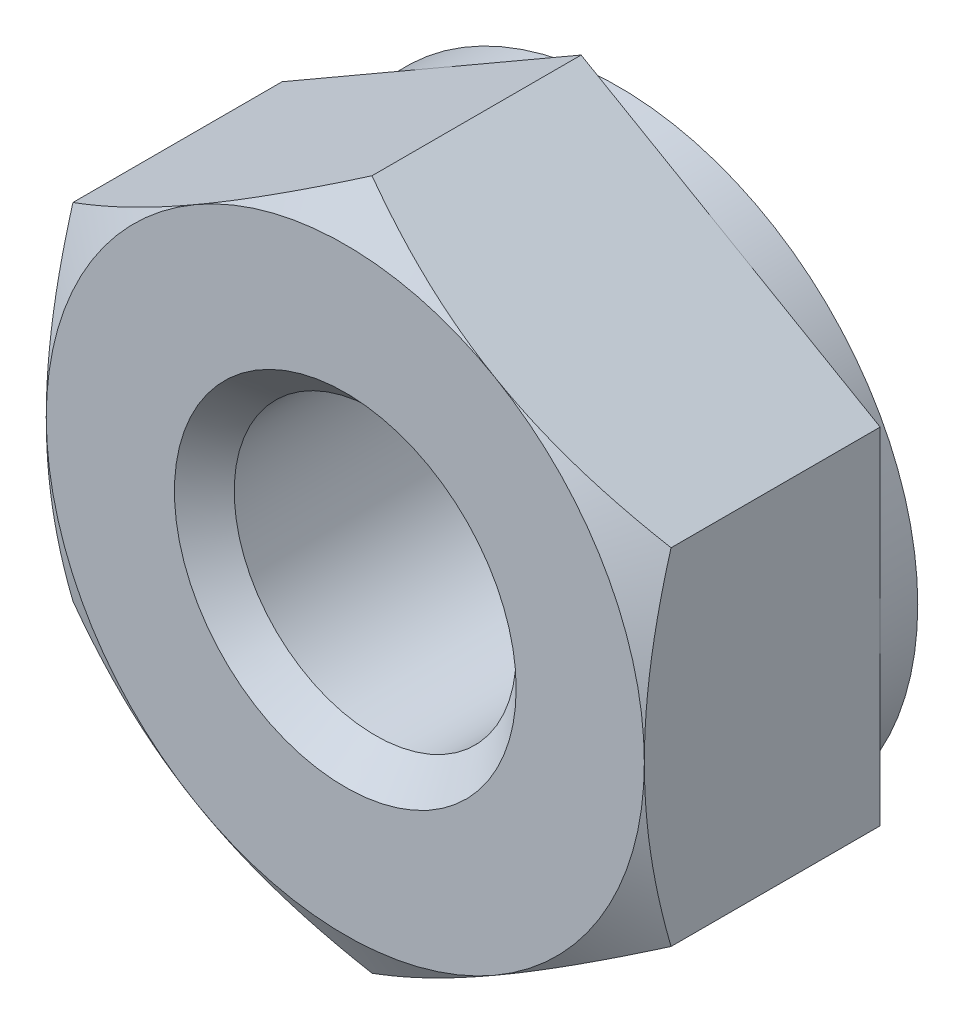
ISO-10303-21;
HEADER;
FILE_DESCRIPTION(('STEP AP214'),'2;1');
FILE_NAME('part.step','',(''),(''),'','','');
FILE_SCHEMA(('AUTOMOTIVE_DESIGN { 1 0 10303 214 1 1 1 1 }'));
ENDSEC;
DATA;
#1=APPLICATION_CONTEXT('core data for automotive mechanical design processes');
#2=APPLICATION_PROTOCOL_DEFINITION('international standard','automotive_design',2000,#1);
#3=PRODUCT_CONTEXT('',#1,'mechanical');
#4=PRODUCT('Part','Part','',(#3));
#5=PRODUCT_RELATED_PRODUCT_CATEGORY('part','',(#4));
#6=PRODUCT_DEFINITION_FORMATION('','',#4);
#7=PRODUCT_DEFINITION_CONTEXT('part definition',#1,'design');
#8=PRODUCT_DEFINITION('design','',#6,#7);
#9=PRODUCT_DEFINITION_SHAPE('','',#8);
#10=(LENGTH_UNIT() NAMED_UNIT(*) SI_UNIT(.MILLI.,.METRE.));
#11=(NAMED_UNIT(*) PLANE_ANGLE_UNIT() SI_UNIT($,.RADIAN.));
#12=(NAMED_UNIT(*) SI_UNIT($,.STERADIAN.) SOLID_ANGLE_UNIT());
#13=UNCERTAINTY_MEASURE_WITH_UNIT(LENGTH_MEASURE(1.E-05),#10,'distance_accuracy_value','');
#14=(GEOMETRIC_REPRESENTATION_CONTEXT(3) GLOBAL_UNCERTAINTY_ASSIGNED_CONTEXT((#13)) GLOBAL_UNIT_ASSIGNED_CONTEXT((#10,
#11,#12)) REPRESENTATION_CONTEXT('',''));
#15=CARTESIAN_POINT('',(0.,0.,0.));
#16=DIRECTION('',(0.,0.,1.));
#17=DIRECTION('',(1.,0.,0.));
#18=AXIS2_PLACEMENT_3D('',#15,#16,#17);
#19=CARTESIAN_POINT('',(3.5,2.02072594216369,-3.2));
#20=DIRECTION('',(0.5,0.866025403784439,0.));
#21=DIRECTION('',(-0.866025403784439,0.5,0.));
#22=AXIS2_PLACEMENT_3D('',#19,#20,#21);
#23=PLANE('',#22);
#24=CARTESIAN_POINT('',(3.5002,2.02061047210985,-0.312674060693367));
#25=CARTESIAN_POINT('',(3.34639282154755,2.10941108799267,-0.261385788989983));
#26=CARTESIAN_POINT('',(3.19125798916558,2.1989782252291,-0.214740953816198));
#27=CARTESIAN_POINT('',(2.87830199342322,2.37966345361545,-0.133321875533351));
#28=CARTESIAN_POINT('',(2.72047526921251,2.47078475532382,-0.0985764355845635));
#29=CARTESIAN_POINT('',(2.40677778961988,2.65189807961074,-0.0444900271828384));
#30=CARTESIAN_POINT('',(2.25095530083931,2.74186223545399,-0.0247890862603842));
#31=CARTESIAN_POINT('',(1.93857711279463,2.92221386641056,-0.0012701327372563));
#32=CARTESIAN_POINT('',(1.78202254896577,3.01260068598001,0.00256735545443381));
#33=CARTESIAN_POINT('',(1.48949078007901,3.1814939814933,-0.00541530187697864));
#34=CARTESIAN_POINT('',(1.3534697875421,3.26002573814993,-0.0152754340696089));
#35=CARTESIAN_POINT('',(1.08231397971101,3.41657761679354,-0.0465264668994056));
#36=CARTESIAN_POINT('',(0.947180102315321,3.49459719728458,-0.0679280432857999));
#37=CARTESIAN_POINT('',(0.675465207594819,3.65147186489429,-0.121430407880578));
#38=CARTESIAN_POINT('',(0.538918580721668,3.73030709667644,-0.153757994445088));
#39=CARTESIAN_POINT('',(0.267861907055501,3.88680174018324,-0.227128933807995));
#40=CARTESIAN_POINT('',(0.133348387531466,3.96446315689009,-0.268155046569867));
#41=CARTESIAN_POINT('',(-0.000199999999999092,4.04156735438122,-0.312674060693368));
#42=B_SPLINE_CURVE_WITH_KNOTS('',3,(#24,#25,#26,#27,#28,#29,#30,#31,#32,#33,#34,#35,#36,#37,#38,
#39,#40,#41),.UNSPECIFIED.,.F.,.F.,(4,2,2,2,2,2,2,2,4),(0.,0.554793832886252,1.11092123814983,
1.65328467083218,2.19498204478403,2.66665130850859,3.13875761298267,3.62133612600509,
4.10296698719187),.UNSPECIFIED.);
#43=CARTESIAN_POINT('',(3.5,2.02072594216369,-0.31260739116964));
#44=VERTEX_POINT('',#43);
#45=CARTESIAN_POINT('',(1.75,3.03108891324554,0.));
#46=VERTEX_POINT('',#45);
#47=EDGE_CURVE('E218',#44,#46,#42,.T.);
#48=ORIENTED_EDGE('',*,*,#47,.F.);
#49=DIRECTION('',(0.,0.,1.));
#50=VECTOR('',#49,1.);
#51=CARTESIAN_POINT('',(3.5,2.02072594216369,-3.2));
#52=LINE('',#51,#50);
#53=CARTESIAN_POINT('',(3.5,2.02072594216369,-2.76));
#54=VERTEX_POINT('',#53);
#55=EDGE_CURVE('E148',#54,#44,#52,.T.);
#56=ORIENTED_EDGE('',*,*,#55,.F.);
#57=DIRECTION('',(0.866025403784439,-0.5,0.));
#58=VECTOR('',#57,1.);
#59=CARTESIAN_POINT('',(3.5,2.02072594216369,-2.76));
#60=LINE('',#59,#58);
#61=CARTESIAN_POINT('',(1.75,3.03108891324554,-2.76));
#62=VERTEX_POINT('',#61);
#63=EDGE_CURVE('E288',#62,#54,#60,.T.);
#64=ORIENTED_EDGE('',*,*,#63,.F.);
#65=CARTESIAN_POINT('',(0.,4.04145188432738,-2.76));
#66=VERTEX_POINT('',#65);
#67=EDGE_CURVE('E140',#66,#62,#60,.T.);
#68=ORIENTED_EDGE('',*,*,#67,.F.);
#69=DIRECTION('',(0.,0.,1.));
#70=VECTOR('',#69,1.);
#71=CARTESIAN_POINT('',(0.,4.04145188432738,-3.2));
#72=LINE('',#71,#70);
#73=CARTESIAN_POINT('',(0.,4.04145188432738,-0.31260739116964));
#74=VERTEX_POINT('',#73);
#75=EDGE_CURVE('E135',#66,#74,#72,.T.);
#76=ORIENTED_EDGE('',*,*,#75,.T.);
#77=EDGE_CURVE('E127',#46,#74,#42,.T.);
#78=ORIENTED_EDGE('',*,*,#77,.F.);
#79=EDGE_LOOP('',(#48,#56,#64,#68,#76,#78));
#80=FACE_BOUND('',#79,.T.);
#81=ADVANCED_FACE('F17',(#80),#23,.T.);
#82=CARTESIAN_POINT('',(3.5,-2.02072594216369,-3.2));
#83=DIRECTION('',(1.,0.,0.));
#84=DIRECTION('',(0.,0.,-1.));
#85=AXIS2_PLACEMENT_3D('',#82,#83,#84);
#86=PLANE('',#85);
#87=CARTESIAN_POINT('',(3.5,-5.35926299121405,-1.67484346858553));
#88=CARTESIAN_POINT('',(3.5,-5.20559319908841,-1.60058173692102));
#89=CARTESIAN_POINT('',(3.5,-5.05156008083374,-1.52705822833146));
#90=CARTESIAN_POINT('',(3.5,-4.74257074180709,-1.38190950344751));
#91=CARTESIAN_POINT('',(3.5,-4.58761436682436,-1.31028461582132));
#92=CARTESIAN_POINT('',(3.5,-4.27574500225541,-1.16897765517623));
#93=CARTESIAN_POINT('',(3.5,-4.11882589028191,-1.09930904568015));
#94=CARTESIAN_POINT('',(3.5,-3.80369792903854,-0.962964262242751));
#95=CARTESIAN_POINT('',(3.5,-3.64548914750594,-0.896287932319509));
#96=CARTESIAN_POINT('',(3.5,-3.32556618401854,-0.76593181909506));
#97=CARTESIAN_POINT('',(3.5,-3.16383281219923,-0.702298873688858));
#98=CARTESIAN_POINT('',(3.5,-2.83845840945597,-0.580016702089487));
#99=CARTESIAN_POINT('',(3.5,-2.67481716858825,-0.521368030370687));
#100=CARTESIAN_POINT('',(3.5,-2.34570278472049,-0.410630279877018));
#101=CARTESIAN_POINT('',(3.5,-2.18023438248742,-0.358527255435855));
#102=CARTESIAN_POINT('',(3.5,-1.84694522806369,-0.26257293697644));
#103=CARTESIAN_POINT('',(3.5,-1.6791252378753,-0.218719033467154));
#104=CARTESIAN_POINT('',(3.5,-1.34101828610925,-0.141391945584783));
#105=CARTESIAN_POINT('',(3.5,-1.17073068027693,-0.107921525211972));
#106=CARTESIAN_POINT('',(3.5,-0.828102385138484,-0.0536149564320513));
#107=CARTESIAN_POINT('',(3.5,-0.655761694017302,-0.032778819195237));
#108=CARTESIAN_POINT('',(3.5,-0.311020490924451,-0.00558408650575726));
#109=CARTESIAN_POINT('',(3.5,-0.138627397207261,0.000866163165910186));
#110=CARTESIAN_POINT('',(3.5,0.206038074906533,-0.00105355807794645));
#111=CARTESIAN_POINT('',(3.5,0.378310473023176,-0.00941968196343097));
#112=CARTESIAN_POINT('',(3.5,0.672490555822325,-0.035768892786891));
#113=CARTESIAN_POINT('',(3.5,0.794722791084092,-0.0503206340384211));
#114=CARTESIAN_POINT('',(3.5,1.03824305430561,-0.0859367340533567));
#115=CARTESIAN_POINT('',(3.5,1.15953093025887,-0.107002119926142));
#116=CARTESIAN_POINT('',(3.5,1.5218791477135,-0.178863187081455));
#117=CARTESIAN_POINT('',(3.5,1.76124104212634,-0.238305275622014));
#118=CARTESIAN_POINT('',(3.5,2.11940971387711,-0.34082681440256));
#119=CARTESIAN_POINT('',(3.5,2.24008344316349,-0.37774969908519));
#120=CARTESIAN_POINT('',(3.5,2.48017139213732,-0.455249007699302));
#121=CARTESIAN_POINT('',(3.5,2.59958641795616,-0.495822911663559));
#122=CARTESIAN_POINT('',(3.5,2.83665760451802,-0.579779986782763));
#123=CARTESIAN_POINT('',(3.5,2.95431988203487,-0.623146060034327));
#124=CARTESIAN_POINT('',(3.5,3.18873153508804,-0.712423559566878));
#125=CARTESIAN_POINT('',(3.5,3.30548051959469,-0.758336014592961));
#126=CARTESIAN_POINT('',(3.5,3.42180736613354,-0.805270380724077));
#127=B_SPLINE_CURVE_WITH_KNOTS('',3,(#87,#88,#89,#90,#91,#92,#93,#94,#95,#96,#97,#98,#99,#100,
#101,#102,#103,#104,#105,#106,#107,#108,#109,#110,#111,#112,#113,#114,#115,#116,#117,#118,#119,
#120,#121,#122,#123,#124,#125,#126),.UNSPECIFIED.,.F.,.F.,(4,2,2,2,2,2,2,2,2,2,2,2,2,2,2,2,2,2,
2,4),(0.,0.512025318465735,1.02413870177436,1.5391827031524,2.05419982499223,2.57553975872797,
3.09693761309352,3.61720506610399,4.13730766217536,4.65754858684363,5.17778997146959,
5.6947072512228,6.21149033452398,6.5805962322233,6.94976036239484,7.68863804939852,
8.06719621660479,8.44549507476762,8.82166461280102,9.19798724733413),.UNSPECIFIED.);
#128=CARTESIAN_POINT('',(3.5,-2.02072594216369,-0.31260739116964));
#129=VERTEX_POINT('',#128);
#130=CARTESIAN_POINT('',(3.5,0.,0.));
#131=VERTEX_POINT('',#130);
#132=EDGE_CURVE('E247',#129,#131,#127,.T.);
#133=ORIENTED_EDGE('',*,*,#132,.F.);
#134=DIRECTION('',(0.,0.,1.));
#135=VECTOR('',#134,1.);
#136=CARTESIAN_POINT('',(3.5,-2.02072594216369,-3.2));
#137=LINE('',#136,#135);
#138=CARTESIAN_POINT('',(3.5,-2.02072594216369,-2.76));
#139=VERTEX_POINT('',#138);
#140=EDGE_CURVE('E308',#139,#129,#137,.T.);
#141=ORIENTED_EDGE('',*,*,#140,.F.);
#142=DIRECTION('',(0.,-1.,0.));
#143=VECTOR('',#142,1.);
#144=CARTESIAN_POINT('',(3.5,-2.02072594216369,-2.76));
#145=LINE('',#144,#143);
#146=CARTESIAN_POINT('',(3.5,0.,-2.76));
#147=VERTEX_POINT('',#146);
#148=EDGE_CURVE('E303',#147,#139,#145,.T.);
#149=ORIENTED_EDGE('',*,*,#148,.F.);
#150=EDGE_CURVE('E293',#54,#147,#145,.T.);
#151=ORIENTED_EDGE('',*,*,#150,.F.);
#152=ORIENTED_EDGE('',*,*,#55,.T.);
#153=EDGE_CURVE('E243',#131,#44,#127,.T.);
#154=ORIENTED_EDGE('',*,*,#153,.F.);
#155=EDGE_LOOP('',(#133,#141,#149,#151,#152,#154));
#156=FACE_BOUND('',#155,.T.);
#157=ADVANCED_FACE('F197',(#156),#86,.T.);
#158=CARTESIAN_POINT('',(0.,-4.04145188432738,-3.2));
#159=DIRECTION('',(0.5,-0.866025403784439,0.));
#160=DIRECTION('',(0.866025403784439,0.5,0.));
#161=AXIS2_PLACEMENT_3D('',#158,#159,#160);
#162=PLANE('',#161);
#163=CARTESIAN_POINT('',(-0.000200000000000895,-4.04156735438122,-0.312674060693367));
#164=CARTESIAN_POINT('',(0.153607178452448,-3.9527667384984,-0.261385788989982));
#165=CARTESIAN_POINT('',(0.308742010834422,-3.86319960126198,-0.214740953816196));
#166=CARTESIAN_POINT('',(0.621698006576779,-3.68251437287562,-0.133321875533349));
#167=CARTESIAN_POINT('',(0.779524730787493,-3.59139307116725,-0.0985764355845612));
#168=CARTESIAN_POINT('',(1.09322221038012,-3.41027974688034,-0.0444900271828357));
#169=CARTESIAN_POINT('',(1.24904469916069,-3.32031559103708,-0.0247890862603811));
#170=CARTESIAN_POINT('',(1.56142288720537,-3.13996396008052,-0.00127013273725415));
#171=CARTESIAN_POINT('',(1.71797745103423,-3.04957714051106,0.00256735545443465));
#172=CARTESIAN_POINT('',(2.01050921992099,-2.88068384499778,-0.00541530187697761));
#173=CARTESIAN_POINT('',(2.1465302124579,-2.80215208834115,-0.0152754340696067));
#174=CARTESIAN_POINT('',(2.41768602028899,-2.64560020969753,-0.0465264668994026));
#175=CARTESIAN_POINT('',(2.55281989768468,-2.5675806292065,-0.0679280432857972));
#176=CARTESIAN_POINT('',(2.82453479240518,-2.41070596159678,-0.121430407880576));
#177=CARTESIAN_POINT('',(2.96108141927833,-2.33187072981463,-0.153757994445086));
#178=CARTESIAN_POINT('',(3.2321380929445,-2.17537608630783,-0.227128933807992));
#179=CARTESIAN_POINT('',(3.36665161246853,-2.09771466960098,-0.268155046569864));
#180=CARTESIAN_POINT('',(3.5002,-2.02061047210985,-0.312674060693366));
#181=B_SPLINE_CURVE_WITH_KNOTS('',3,(#163,#164,#165,#166,#167,#168,#169,#170,#171,#172,#173,
#174,#175,#176,#177,#178,#179,#180),.UNSPECIFIED.,.F.,.F.,(4,2,2,2,2,2,2,2,4),(0.,
0.554793832886252,1.11092123814983,1.65328467083218,2.19498204478403,2.6666513085086,
3.13875761298267,3.62133612600509,4.10296698719187),.UNSPECIFIED.);
#182=CARTESIAN_POINT('',(0.,-4.04145188432738,-0.31260739116964));
#183=VERTEX_POINT('',#182);
#184=CARTESIAN_POINT('',(1.75,-3.03108891324554,0.));
#185=VERTEX_POINT('',#184);
#186=EDGE_CURVE('E32',#183,#185,#181,.T.);
#187=ORIENTED_EDGE('',*,*,#186,.F.);
#188=DIRECTION('',(0.,0.,1.));
#189=VECTOR('',#188,1.);
#190=CARTESIAN_POINT('',(0.,-4.04145188432738,-3.2));
#191=LINE('',#190,#189);
#192=CARTESIAN_POINT('',(0.,-4.04145188432738,-2.76));
#193=VERTEX_POINT('',#192);
#194=EDGE_CURVE('E137',#193,#183,#191,.T.);
#195=ORIENTED_EDGE('',*,*,#194,.F.);
#196=DIRECTION('',(-0.866025403784439,-0.5,0.));
#197=VECTOR('',#196,1.);
#198=CARTESIAN_POINT('',(0.,-4.04145188432738,-2.76));
#199=LINE('',#198,#197);
#200=CARTESIAN_POINT('',(1.75,-3.03108891324554,-2.76));
#201=VERTEX_POINT('',#200);
#202=EDGE_CURVE('E319',#201,#193,#199,.T.);
#203=ORIENTED_EDGE('',*,*,#202,.F.);
#204=EDGE_CURVE('E339',#139,#201,#199,.T.);
#205=ORIENTED_EDGE('',*,*,#204,.F.);
#206=ORIENTED_EDGE('',*,*,#140,.T.);
#207=EDGE_CURVE('E248',#185,#129,#181,.T.);
#208=ORIENTED_EDGE('',*,*,#207,.F.);
#209=EDGE_LOOP('',(#187,#195,#203,#205,#206,#208));
#210=FACE_BOUND('',#209,.T.);
#211=ADVANCED_FACE('F204',(#210),#162,.T.);
#212=CARTESIAN_POINT('',(-3.5,-2.02072594216369,-3.2));
#213=DIRECTION('',(-0.5,-0.866025403784439,0.));
#214=DIRECTION('',(0.866025403784439,-0.5,0.));
#215=AXIS2_PLACEMENT_3D('',#212,#213,#214);
#216=PLANE('',#215);
#217=CARTESIAN_POINT('',(-3.5002,-2.02061047210985,-0.312674060693367));
#218=CARTESIAN_POINT('',(-3.34639282154755,-2.10941108799267,-0.261385788989982));
#219=CARTESIAN_POINT('',(-3.19125798916558,-2.19897822522909,-0.214740953816196));
#220=CARTESIAN_POINT('',(-2.87830199342322,-2.37966345361545,-0.133321875533349));
#221=CARTESIAN_POINT('',(-2.7204752692125,-2.47078475532382,-0.0985764355845613));
#222=CARTESIAN_POINT('',(-2.40677778961987,-2.65189807961073,-0.0444900271828359));
#223=CARTESIAN_POINT('',(-2.25095530083931,-2.74186223545399,-0.0247890862603814));
#224=CARTESIAN_POINT('',(-1.93857711279463,-2.92221386641055,-0.0012701327372542));
#225=CARTESIAN_POINT('',(-1.78202254896577,-3.01260068598001,0.00256735545443505));
#226=CARTESIAN_POINT('',(-1.48949078007901,-3.1814939814933,-0.00541530187697725));
#227=CARTESIAN_POINT('',(-1.3534697875421,-3.26002573814993,-0.0152754340696067));
#228=CARTESIAN_POINT('',(-1.08231397971101,-3.41657761679353,-0.0465264668994029));
#229=CARTESIAN_POINT('',(-0.947180102315318,-3.49459719728457,-0.0679280432857973));
#230=CARTESIAN_POINT('',(-0.675465207594817,-3.65147186489429,-0.121430407880576));
#231=CARTESIAN_POINT('',(-0.538918580721665,-3.73030709667644,-0.153757994445086));
#232=CARTESIAN_POINT('',(-0.267861907055499,-3.88680174018324,-0.227128933807993));
#233=CARTESIAN_POINT('',(-0.133348387531463,-3.96446315689009,-0.268155046569865));
#234=CARTESIAN_POINT('',(0.000199999999999406,-4.04156735438122,-0.312674060693367));
#235=B_SPLINE_CURVE_WITH_KNOTS('',3,(#217,#218,#219,#220,#221,#222,#223,#224,#225,#226,#227,
#228,#229,#230,#231,#232,#233,#234),.UNSPECIFIED.,.F.,.F.,(4,2,2,2,2,2,2,2,4),(0.,
0.554793832886253,1.11092123814984,1.65328467083218,2.19498204478403,2.6666513085086,
3.13875761298267,3.6213361260051,4.10296698719187),.UNSPECIFIED.);
#236=CARTESIAN_POINT('',(-3.5,-2.02072594216369,-0.31260739116964));
#237=VERTEX_POINT('',#236);
#238=CARTESIAN_POINT('',(-1.75,-3.03108891324554,0.));
#239=VERTEX_POINT('',#238);
#240=EDGE_CURVE('E40',#237,#239,#235,.T.);
#241=ORIENTED_EDGE('',*,*,#240,.F.);
#242=DIRECTION('',(0.,0.,1.));
#243=VECTOR('',#242,1.);
#244=CARTESIAN_POINT('',(-3.5,-2.02072594216369,-3.2));
#245=LINE('',#244,#243);
#246=CARTESIAN_POINT('',(-3.5,-2.02072594216369,-2.76));
#247=VERTEX_POINT('',#246);
#248=EDGE_CURVE('E134',#247,#237,#245,.T.);
#249=ORIENTED_EDGE('',*,*,#248,.F.);
#250=DIRECTION('',(-0.866025403784439,0.5,0.));
#251=VECTOR('',#250,1.);
#252=CARTESIAN_POINT('',(-3.5,-2.02072594216369,-2.76));
#253=LINE('',#252,#251);
#254=CARTESIAN_POINT('',(-1.75,-3.03108891324554,-2.76));
#255=VERTEX_POINT('',#254);
#256=EDGE_CURVE('E343',#255,#247,#253,.T.);
#257=ORIENTED_EDGE('',*,*,#256,.F.);
#258=EDGE_CURVE('E316',#193,#255,#253,.T.);
#259=ORIENTED_EDGE('',*,*,#258,.F.);
#260=ORIENTED_EDGE('',*,*,#194,.T.);
#261=EDGE_CURVE('E314',#239,#183,#235,.T.);
#262=ORIENTED_EDGE('',*,*,#261,.F.);
#263=EDGE_LOOP('',(#241,#249,#257,#259,#260,#262));
#264=FACE_BOUND('',#263,.T.);
#265=ADVANCED_FACE('F259',(#264),#216,.T.);
#266=CARTESIAN_POINT('',(-3.5,2.02072594216369,-3.2));
#267=DIRECTION('',(-1.,0.,0.));
#268=DIRECTION('',(0.,0.,1.));
#269=AXIS2_PLACEMENT_3D('',#266,#267,#268);
#270=PLANE('',#269);
#271=CARTESIAN_POINT('',(-3.5,-5.35926299121405,-1.67484346858553));
#272=CARTESIAN_POINT('',(-3.5,-5.20559319908841,-1.60058173692102));
#273=CARTESIAN_POINT('',(-3.5,-5.05156008083374,-1.52705822833146));
#274=CARTESIAN_POINT('',(-3.5,-4.74257074180709,-1.38190950344751));
#275=CARTESIAN_POINT('',(-3.5,-4.58761436682435,-1.31028461582132));
#276=CARTESIAN_POINT('',(-3.5,-4.27574500225541,-1.16897765517623));
#277=CARTESIAN_POINT('',(-3.5,-4.11882589028191,-1.09930904568015));
#278=CARTESIAN_POINT('',(-3.5,-3.80369792903854,-0.962964262242751));
#279=CARTESIAN_POINT('',(-3.5,-3.64548914750594,-0.896287932319509));
#280=CARTESIAN_POINT('',(-3.5,-3.32556618401854,-0.765931819095059));
#281=CARTESIAN_POINT('',(-3.5,-3.16383281219923,-0.702298873688857));
#282=CARTESIAN_POINT('',(-3.5,-2.83845840945596,-0.580016702089486));
#283=CARTESIAN_POINT('',(-3.5,-2.67481716858825,-0.521368030370686));
#284=CARTESIAN_POINT('',(-3.5,-2.34570278472048,-0.410630279877017));
#285=CARTESIAN_POINT('',(-3.5,-2.18023438248742,-0.358527255435854));
#286=CARTESIAN_POINT('',(-3.5,-1.84694522806369,-0.26257293697644));
#287=CARTESIAN_POINT('',(-3.5,-1.67912523787529,-0.218719033467155));
#288=CARTESIAN_POINT('',(-3.5,-1.34101828610924,-0.141391945584784));
#289=CARTESIAN_POINT('',(-3.5,-1.17073068027693,-0.107921525211971));
#290=CARTESIAN_POINT('',(-3.5,-0.82810238513848,-0.0536149564320502));
#291=CARTESIAN_POINT('',(-3.5,-0.655761694017298,-0.0327788191952366));
#292=CARTESIAN_POINT('',(-3.5,-0.311020490924447,-0.00558408650575719));
#293=CARTESIAN_POINT('',(-3.5,-0.138627397207258,0.000866163165910635));
#294=CARTESIAN_POINT('',(-3.5,0.206038074906535,-0.00105355807794691));
#295=CARTESIAN_POINT('',(-3.5,0.378310473023179,-0.00941968196343274));
#296=CARTESIAN_POINT('',(-3.5,0.672490555822329,-0.0357688927868928));
#297=CARTESIAN_POINT('',(-3.5,0.794722791084096,-0.0503206340384223));
#298=CARTESIAN_POINT('',(-3.5,1.03824305430561,-0.0859367340533575));
#299=CARTESIAN_POINT('',(-3.5,1.15953093025888,-0.107002119926143));
#300=CARTESIAN_POINT('',(-3.5,1.5218791477135,-0.178863187081456));
#301=CARTESIAN_POINT('',(-3.5,1.76124104212634,-0.238305275622015));
#302=CARTESIAN_POINT('',(-3.5,2.11940971387711,-0.340826814402562));
#303=CARTESIAN_POINT('',(-3.5,2.2400834431635,-0.377749699085192));
#304=CARTESIAN_POINT('',(-3.5,2.48017139213732,-0.455249007699304));
#305=CARTESIAN_POINT('',(-3.5,2.59958641795617,-0.495822911663561));
#306=CARTESIAN_POINT('',(-3.5,2.83665760451803,-0.579779986782766));
#307=CARTESIAN_POINT('',(-3.5,2.95431988203488,-0.62314606003433));
#308=CARTESIAN_POINT('',(-3.5,3.18873153508805,-0.712423559566882));
#309=CARTESIAN_POINT('',(-3.5,3.3054805195947,-0.758336014592965));
#310=CARTESIAN_POINT('',(-3.5,3.42180736613355,-0.805270380724082));
#311=B_SPLINE_CURVE_WITH_KNOTS('',3,(#271,#272,#273,#274,#275,#276,#277,#278,#279,#280,#281,
#282,#283,#284,#285,#286,#287,#288,#289,#290,#291,#292,#293,#294,#295,#296,#297,#298,#299,#300,
#301,#302,#303,#304,#305,#306,#307,#308,#309,#310),.UNSPECIFIED.,.F.,.F.,(4,2,2,2,2,2,2,2,2,2,2,
2,2,2,2,2,2,2,2,4),(0.,0.512025318465736,1.02413870177436,1.53918270315241,2.05419982499223,
2.57553975872797,3.09693761309352,3.61720506610399,4.13730766217536,4.65754858684363,
5.1777899714696,5.6947072512228,6.21149033452399,6.5805962322233,6.94976036239484,
7.68863804939852,8.0671962166048,8.44549507476763,8.82166461280102,9.19798724733415),.UNSPECIFIED.);
#312=CARTESIAN_POINT('',(-3.5,2.02072594216369,-0.31260739116964));
#313=VERTEX_POINT('',#312);
#314=CARTESIAN_POINT('',(-3.5,0.,0.));
#315=VERTEX_POINT('',#314);
#316=EDGE_CURVE('E110',#313,#315,#311,.F.);
#317=ORIENTED_EDGE('',*,*,#316,.F.);
#318=DIRECTION('',(0.,0.,1.));
#319=VECTOR('',#318,1.);
#320=CARTESIAN_POINT('',(-3.5,2.02072594216369,-3.2));
#321=LINE('',#320,#319);
#322=CARTESIAN_POINT('',(-3.5,2.02072594216369,-2.76));
#323=VERTEX_POINT('',#322);
#324=EDGE_CURVE('E124',#323,#313,#321,.T.);
#325=ORIENTED_EDGE('',*,*,#324,.F.);
#326=DIRECTION('',(0.,1.,0.));
#327=VECTOR('',#326,1.);
#328=CARTESIAN_POINT('',(-3.5,2.02072594216369,-2.76));
#329=LINE('',#328,#327);
#330=CARTESIAN_POINT('',(-3.5,0.,-2.76));
#331=VERTEX_POINT('',#330);
#332=EDGE_CURVE('E346',#331,#323,#329,.T.);
#333=ORIENTED_EDGE('',*,*,#332,.F.);
#334=EDGE_CURVE('E345',#247,#331,#329,.T.);
#335=ORIENTED_EDGE('',*,*,#334,.F.);
#336=ORIENTED_EDGE('',*,*,#248,.T.);
#337=EDGE_CURVE('E126',#315,#237,#311,.F.);
#338=ORIENTED_EDGE('',*,*,#337,.F.);
#339=EDGE_LOOP('',(#317,#325,#333,#335,#336,#338));
#340=FACE_BOUND('',#339,.T.);
#341=ADVANCED_FACE('F122',(#340),#270,.T.);
#342=CARTESIAN_POINT('',(0.,4.04145188432738,-3.2));
#343=DIRECTION('',(-0.5,0.866025403784439,0.));
#344=DIRECTION('',(-0.866025403784439,-0.5,0.));
#345=AXIS2_PLACEMENT_3D('',#342,#343,#344);
#346=PLANE('',#345);
#347=CARTESIAN_POINT('',(0.000200000000000898,4.04156735438122,-0.312674060693368));
#348=CARTESIAN_POINT('',(-0.153607178452448,3.9527667384984,-0.261385788989982));
#349=CARTESIAN_POINT('',(-0.308742010834422,3.86319960126198,-0.214740953816196));
#350=CARTESIAN_POINT('',(-0.621698006576778,3.68251437287562,-0.133321875533349));
#351=CARTESIAN_POINT('',(-0.779524730787493,3.59139307116725,-0.0985764355845613));
#352=CARTESIAN_POINT('',(-1.09322221038012,3.41027974688034,-0.0444900271828356));
#353=CARTESIAN_POINT('',(-1.24904469916069,3.32031559103708,-0.0247890862603808));
#354=CARTESIAN_POINT('',(-1.56142288720537,3.13996396008052,-0.00127013273725436));
#355=CARTESIAN_POINT('',(-1.71797745103423,3.04957714051106,0.00256735545443369));
#356=CARTESIAN_POINT('',(-2.01050921992099,2.88068384499778,-0.00541530187697842));
#357=CARTESIAN_POINT('',(-2.1465302124579,2.80215208834115,-0.0152754340696068));
#358=CARTESIAN_POINT('',(-2.41768602028899,2.64560020969753,-0.0465264668994023));
#359=CARTESIAN_POINT('',(-2.55281989768468,2.5675806292065,-0.0679280432857972));
#360=CARTESIAN_POINT('',(-2.82453479240518,2.41070596159678,-0.121430407880576));
#361=CARTESIAN_POINT('',(-2.96108141927833,2.33187072981463,-0.153757994445086));
#362=CARTESIAN_POINT('',(-3.2321380929445,2.17537608630783,-0.227128933807993));
#363=CARTESIAN_POINT('',(-3.36665161246853,2.09771466960098,-0.268155046569865));
#364=CARTESIAN_POINT('',(-3.5002,2.02061047210985,-0.312674060693368));
#365=B_SPLINE_CURVE_WITH_KNOTS('',3,(#347,#348,#349,#350,#351,#352,#353,#354,#355,#356,#357,
#358,#359,#360,#361,#362,#363,#364),.UNSPECIFIED.,.F.,.F.,(4,2,2,2,2,2,2,2,4),(0.,
0.554793832886252,1.11092123814983,1.65328467083218,2.19498204478403,2.6666513085086,
3.13875761298267,3.62133612600509,4.10296698719187),.UNSPECIFIED.);
#366=CARTESIAN_POINT('',(-1.75,3.03108891324554,0.));
#367=VERTEX_POINT('',#366);
#368=EDGE_CURVE('E117',#74,#367,#365,.T.);
#369=ORIENTED_EDGE('',*,*,#368,.F.);
#370=ORIENTED_EDGE('',*,*,#75,.F.);
#371=DIRECTION('',(0.866025403784439,0.5,0.));
#372=VECTOR('',#371,1.);
#373=CARTESIAN_POINT('',(0.,4.04145188432738,-2.76));
#374=LINE('',#373,#372);
#375=CARTESIAN_POINT('',(-1.75,3.03108891324554,-2.76));
#376=VERTEX_POINT('',#375);
#377=EDGE_CURVE('E147',#376,#66,#374,.T.);
#378=ORIENTED_EDGE('',*,*,#377,.F.);
#379=EDGE_CURVE('E133',#323,#376,#374,.T.);
#380=ORIENTED_EDGE('',*,*,#379,.F.);
#381=ORIENTED_EDGE('',*,*,#324,.T.);
#382=EDGE_CURVE('E107',#367,#313,#365,.T.);
#383=ORIENTED_EDGE('',*,*,#382,.F.);
#384=EDGE_LOOP('',(#369,#370,#378,#380,#381,#383));
#385=FACE_BOUND('',#384,.T.);
#386=ADVANCED_FACE('F130',(#385),#346,.T.);
#387=CARTESIAN_POINT('',(0.,7.04145188432738,-2.76));
#388=DIRECTION('',(0.,0.,1.));
#389=DIRECTION('',(1.,0.,0.));
#390=AXIS2_PLACEMENT_3D('',#387,#388,#389);
#391=PLANE('',#390);
#392=ORIENTED_EDGE('',*,*,#67,.T.);
#393=CARTESIAN_POINT('',(0.,0.,-2.76));
#394=DIRECTION('',(0.,0.,-1.));
#395=DIRECTION('',(-1.,0.,0.));
#396=AXIS2_PLACEMENT_3D('',#393,#394,#395);
#397=CIRCLE('',#396,3.5);
#398=EDGE_CURVE('E285',#376,#62,#397,.T.);
#399=ORIENTED_EDGE('',*,*,#398,.F.);
#400=ORIENTED_EDGE('',*,*,#377,.T.);
#401=EDGE_LOOP('',(#392,#399,#400));
#402=FACE_BOUND('',#401,.T.);
#403=ADVANCED_FACE('F192',(#402),#391,.F.);
#404=ORIENTED_EDGE('',*,*,#63,.T.);
#405=ORIENTED_EDGE('',*,*,#150,.T.);
#406=EDGE_CURVE('E291',#62,#147,#397,.T.);
#407=ORIENTED_EDGE('',*,*,#406,.F.);
#408=EDGE_LOOP('',(#404,#405,#407));
#409=FACE_BOUND('',#408,.T.);
#410=ADVANCED_FACE('F274',(#409),#391,.F.);
#411=ORIENTED_EDGE('',*,*,#148,.T.);
#412=ORIENTED_EDGE('',*,*,#204,.T.);
#413=EDGE_CURVE('E297',#147,#201,#397,.T.);
#414=ORIENTED_EDGE('',*,*,#413,.F.);
#415=EDGE_LOOP('',(#411,#412,#414));
#416=FACE_BOUND('',#415,.T.);
#417=ADVANCED_FACE('F280',(#416),#391,.F.);
#418=ORIENTED_EDGE('',*,*,#202,.T.);
#419=ORIENTED_EDGE('',*,*,#258,.T.);
#420=EDGE_CURVE('E322',#201,#255,#397,.T.);
#421=ORIENTED_EDGE('',*,*,#420,.F.);
#422=EDGE_LOOP('',(#418,#419,#421));
#423=FACE_BOUND('',#422,.T.);
#424=ADVANCED_FACE('F193',(#423),#391,.F.);
#425=ORIENTED_EDGE('',*,*,#256,.T.);
#426=ORIENTED_EDGE('',*,*,#334,.T.);
#427=EDGE_CURVE('E321',#255,#331,#397,.T.);
#428=ORIENTED_EDGE('',*,*,#427,.F.);
#429=EDGE_LOOP('',(#425,#426,#428));
#430=FACE_BOUND('',#429,.T.);
#431=ADVANCED_FACE('F181',(#430),#391,.F.);
#432=CARTESIAN_POINT('',(0.,0.,0.));
#433=DIRECTION('',(0.,0.,-1.));
#434=DIRECTION('',(-1.,0.,0.));
#435=AXIS2_PLACEMENT_3D('',#432,#433,#434);
#436=CYLINDRICAL_SURFACE('',#435,3.5);
#437=ORIENTED_EDGE('',*,*,#398,.T.);
#438=ORIENTED_EDGE('',*,*,#406,.T.);
#439=ORIENTED_EDGE('',*,*,#413,.T.);
#440=ORIENTED_EDGE('',*,*,#420,.T.);
#441=ORIENTED_EDGE('',*,*,#427,.T.);
#442=EDGE_CURVE('E300',#331,#376,#397,.T.);
#443=ORIENTED_EDGE('',*,*,#442,.T.);
#444=EDGE_LOOP('',(#437,#438,#439,#440,#441,#443));
#445=FACE_BOUND('',#444,.T.);
#446=CARTESIAN_POINT('',(0.,0.,-3.2));
#447=DIRECTION('',(0.,0.,1.));
#448=DIRECTION('',(1.,0.,0.));
#449=AXIS2_PLACEMENT_3D('',#446,#447,#448);
#450=CIRCLE('',#449,3.5);
#451=CARTESIAN_POINT('',(3.5,0.,-3.2));
#452=VERTEX_POINT('',#451);
#453=EDGE_CURVE('E144',#452,#452,#450,.F.);
#454=ORIENTED_EDGE('',*,*,#453,.F.);
#455=EDGE_LOOP('',(#454));
#456=FACE_BOUND('',#455,.T.);
#457=ADVANCED_FACE('F179',(#445,#456),#436,.T.);
#458=ORIENTED_EDGE('',*,*,#332,.T.);
#459=ORIENTED_EDGE('',*,*,#379,.T.);
#460=ORIENTED_EDGE('',*,*,#442,.F.);
#461=EDGE_LOOP('',(#458,#459,#460));
#462=FACE_BOUND('',#461,.T.);
#463=ADVANCED_FACE('F175',(#462),#391,.F.);
#464=CARTESIAN_POINT('',(0.,4.04145188432738,-3.2));
#465=DIRECTION('',(0.,0.,1.));
#466=DIRECTION('',(1.,0.,0.));
#467=AXIS2_PLACEMENT_3D('',#464,#465,#466);
#468=PLANE('',#467);
#469=CARTESIAN_POINT('',(0.,0.,-3.2));
#470=DIRECTION('',(0.,0.,1.));
#471=DIRECTION('',(1.,0.,0.));
#472=AXIS2_PLACEMENT_3D('',#469,#470,#471);
#473=CIRCLE('',#472,2.);
#474=CARTESIAN_POINT('',(2.,0.,-3.2));
#475=VERTEX_POINT('',#474);
#476=EDGE_CURVE('E155',#475,#475,#473,.T.);
#477=ORIENTED_EDGE('',*,*,#476,.T.);
#478=EDGE_LOOP('',(#477));
#479=FACE_BOUND('',#478,.T.);
#480=ORIENTED_EDGE('',*,*,#453,.T.);
#481=EDGE_LOOP('',(#480));
#482=FACE_BOUND('',#481,.T.);
#483=ADVANCED_FACE('F171',(#479,#482),#468,.F.);
#484=CARTESIAN_POINT('',(0.,0.,0.));
#485=DIRECTION('',(0.,0.,-1.));
#486=DIRECTION('',(-1.,0.,0.));
#487=AXIS2_PLACEMENT_3D('',#484,#485,#486);
#488=CONICAL_SURFACE('',#487,3.5,1.0471975511966);
#489=ORIENTED_EDGE('',*,*,#153,.T.);
#490=ORIENTED_EDGE('',*,*,#47,.T.);
#491=CARTESIAN_POINT('',(0.,0.,0.));
#492=DIRECTION('',(0.,0.,1.));
#493=DIRECTION('',(1.,0.,0.));
#494=AXIS2_PLACEMENT_3D('',#491,#492,#493);
#495=CIRCLE('',#494,3.5);
#496=EDGE_CURVE('E150',#46,#131,#495,.F.);
#497=ORIENTED_EDGE('',*,*,#496,.T.);
#498=EDGE_LOOP('',(#489,#490,#497));
#499=FACE_BOUND('',#498,.T.);
#500=ADVANCED_FACE('F174',(#499),#488,.T.);
#501=ORIENTED_EDGE('',*,*,#77,.T.);
#502=ORIENTED_EDGE('',*,*,#368,.T.);
#503=EDGE_CURVE('E153',#367,#46,#495,.F.);
#504=ORIENTED_EDGE('',*,*,#503,.T.);
#505=EDGE_LOOP('',(#501,#502,#504));
#506=FACE_BOUND('',#505,.T.);
#507=ADVANCED_FACE('F231',(#506),#488,.T.);
#508=ORIENTED_EDGE('',*,*,#316,.T.);
#509=CARTESIAN_POINT('',(0.,0.,0.));
#510=DIRECTION('',(0.,0.,-1.));
#511=DIRECTION('',(-1.,0.,0.));
#512=AXIS2_PLACEMENT_3D('',#509,#510,#511);
#513=CIRCLE('',#512,3.5);
#514=EDGE_CURVE('E112',#315,#367,#513,.T.);
#515=ORIENTED_EDGE('',*,*,#514,.T.);
#516=ORIENTED_EDGE('',*,*,#382,.T.);
#517=EDGE_LOOP('',(#508,#515,#516));
#518=FACE_BOUND('',#517,.T.);
#519=ADVANCED_FACE('F109',(#518),#488,.T.);
#520=ORIENTED_EDGE('',*,*,#240,.T.);
#521=EDGE_CURVE('E334',#239,#315,#495,.F.);
#522=ORIENTED_EDGE('',*,*,#521,.T.);
#523=ORIENTED_EDGE('',*,*,#337,.T.);
#524=EDGE_LOOP('',(#520,#522,#523));
#525=FACE_BOUND('',#524,.T.);
#526=ADVANCED_FACE('F230',(#525),#488,.T.);
#527=ORIENTED_EDGE('',*,*,#186,.T.);
#528=EDGE_CURVE('E335',#185,#239,#495,.F.);
#529=ORIENTED_EDGE('',*,*,#528,.T.);
#530=ORIENTED_EDGE('',*,*,#261,.T.);
#531=EDGE_LOOP('',(#527,#529,#530));
#532=FACE_BOUND('',#531,.T.);
#533=ADVANCED_FACE('F232',(#532),#488,.T.);
#534=ORIENTED_EDGE('',*,*,#207,.T.);
#535=ORIENTED_EDGE('',*,*,#132,.T.);
#536=EDGE_CURVE('E154',#131,#185,#495,.F.);
#537=ORIENTED_EDGE('',*,*,#536,.T.);
#538=EDGE_LOOP('',(#534,#535,#537));
#539=FACE_BOUND('',#538,.T.);
#540=ADVANCED_FACE('F337',(#539),#488,.T.);
#541=CARTESIAN_POINT('',(0.,4.04145188432738,0.));
#542=DIRECTION('',(0.,0.,1.));
#543=DIRECTION('',(1.,0.,0.));
#544=AXIS2_PLACEMENT_3D('',#541,#542,#543);
#545=PLANE('',#544);
#546=CARTESIAN_POINT('',(0.,0.,0.));
#547=DIRECTION('',(0.,0.,1.));
#548=DIRECTION('',(1.,0.,0.));
#549=AXIS2_PLACEMENT_3D('',#546,#547,#548);
#550=CIRCLE('',#549,2.);
#551=CARTESIAN_POINT('',(2.,0.,0.));
#552=VERTEX_POINT('',#551);
#553=EDGE_CURVE('E11',#552,#552,#550,.F.);
#554=ORIENTED_EDGE('',*,*,#553,.T.);
#555=EDGE_LOOP('',(#554));
#556=FACE_BOUND('',#555,.T.);
#557=ORIENTED_EDGE('',*,*,#536,.F.);
#558=ORIENTED_EDGE('',*,*,#496,.F.);
#559=ORIENTED_EDGE('',*,*,#503,.F.);
#560=ORIENTED_EDGE('',*,*,#514,.F.);
#561=ORIENTED_EDGE('',*,*,#521,.F.);
#562=ORIENTED_EDGE('',*,*,#528,.F.);
#563=EDGE_LOOP('',(#557,#558,#559,#560,#561,#562));
#564=FACE_BOUND('',#563,.T.);
#565=ADVANCED_FACE('F256',(#556,#564),#545,.T.);
#566=CARTESIAN_POINT('',(0.,0.,0.));
#567=DIRECTION('',(0.,0.,1.));
#568=DIRECTION('',(1.,0.,0.));
#569=AXIS2_PLACEMENT_3D('',#566,#567,#568);
#570=CYLINDRICAL_SURFACE('',#569,1.65);
#571=CARTESIAN_POINT('',(0.,0.,-2.85));
#572=DIRECTION('',(0.,0.,1.));
#573=DIRECTION('',(1.,0.,0.));
#574=AXIS2_PLACEMENT_3D('',#571,#572,#573);
#575=CIRCLE('',#574,1.65);
#576=CARTESIAN_POINT('',(1.65,0.,-2.85));
#577=VERTEX_POINT('',#576);
#578=EDGE_CURVE('E25',#577,#577,#575,.F.);
#579=ORIENTED_EDGE('',*,*,#578,.T.);
#580=EDGE_LOOP('',(#579));
#581=FACE_BOUND('',#580,.T.);
#582=CARTESIAN_POINT('',(0.,0.,-0.35));
#583=DIRECTION('',(0.,0.,1.));
#584=DIRECTION('',(1.,0.,0.));
#585=AXIS2_PLACEMENT_3D('',#582,#583,#584);
#586=CIRCLE('',#585,1.65);
#587=CARTESIAN_POINT('',(1.65,0.,-0.35));
#588=VERTEX_POINT('',#587);
#589=EDGE_CURVE('E158',#588,#588,#586,.T.);
#590=ORIENTED_EDGE('',*,*,#589,.T.);
#591=EDGE_LOOP('',(#590));
#592=FACE_BOUND('',#591,.T.);
#593=ADVANCED_FACE('F163',(#581,#592),#570,.F.);
#594=CARTESIAN_POINT('',(0.,0.,-3.2));
#595=DIRECTION('',(0.,0.,-1.));
#596=DIRECTION('',(-1.,0.,0.));
#597=AXIS2_PLACEMENT_3D('',#594,#595,#596);
#598=CONICAL_SURFACE('',#597,2.,0.785398163397448);
#599=ORIENTED_EDGE('',*,*,#578,.F.);
#600=EDGE_LOOP('',(#599));
#601=FACE_BOUND('',#600,.T.);
#602=ORIENTED_EDGE('',*,*,#476,.F.);
#603=EDGE_LOOP('',(#602));
#604=FACE_BOUND('',#603,.T.);
#605=ADVANCED_FACE('F166',(#601,#604),#598,.F.);
#606=CARTESIAN_POINT('',(0.,0.,-0.35));
#607=DIRECTION('',(0.,0.,1.));
#608=DIRECTION('',(1.,0.,0.));
#609=AXIS2_PLACEMENT_3D('',#606,#607,#608);
#610=CONICAL_SURFACE('',#609,1.65,0.785398163397452);
#611=ORIENTED_EDGE('',*,*,#553,.F.);
#612=EDGE_LOOP('',(#611));
#613=FACE_BOUND('',#612,.T.);
#614=ORIENTED_EDGE('',*,*,#589,.F.);
#615=EDGE_LOOP('',(#614));
#616=FACE_BOUND('',#615,.T.);
#617=ADVANCED_FACE('F19',(#613,#616),#610,.F.);
#618=CLOSED_SHELL('',(#81,#157,#211,#265,#341,#386,#403,#410,#417,#424,#431,#457,#463,#483,#500,
#507,#519,#526,#533,#540,#565,#593,#605,#617));
#619=MANIFOLD_SOLID_BREP('B1',#618);
#620=ADVANCED_BREP_SHAPE_REPRESENTATION('',(#18,#619),#14);
#621=SHAPE_DEFINITION_REPRESENTATION(#9,#620);
ENDSEC;
END-ISO-10303-21;
